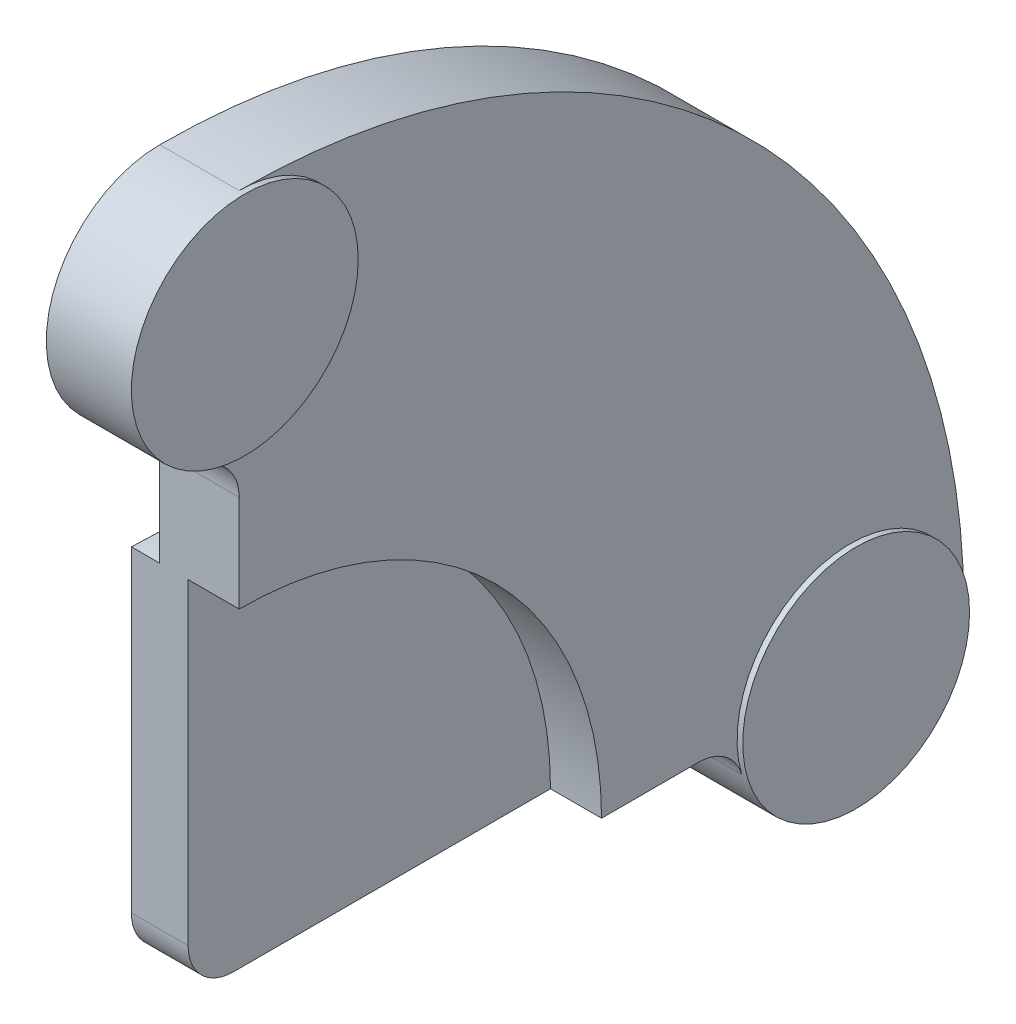
ISO-10303-21;
HEADER;
FILE_DESCRIPTION(('STEP AP214'),'2;1');
FILE_NAME('part.step','',(''),(''),'','','');
FILE_SCHEMA(('AUTOMOTIVE_DESIGN { 1 0 10303 214 1 1 1 1 }'));
ENDSEC;
DATA;
#1=APPLICATION_CONTEXT('core data for automotive mechanical design processes');
#2=APPLICATION_PROTOCOL_DEFINITION('international standard','automotive_design',2000,#1);
#3=PRODUCT_CONTEXT('',#1,'mechanical');
#4=PRODUCT('Part','Part','',(#3));
#5=PRODUCT_RELATED_PRODUCT_CATEGORY('part','',(#4));
#6=PRODUCT_DEFINITION_FORMATION('','',#4);
#7=PRODUCT_DEFINITION_CONTEXT('part definition',#1,'design');
#8=PRODUCT_DEFINITION('design','',#6,#7);
#9=PRODUCT_DEFINITION_SHAPE('','',#8);
#10=(LENGTH_UNIT() NAMED_UNIT(*) SI_UNIT(.MILLI.,.METRE.));
#11=(NAMED_UNIT(*) PLANE_ANGLE_UNIT() SI_UNIT($,.RADIAN.));
#12=(NAMED_UNIT(*) SI_UNIT($,.STERADIAN.) SOLID_ANGLE_UNIT());
#13=UNCERTAINTY_MEASURE_WITH_UNIT(LENGTH_MEASURE(1.E-05),#10,'distance_accuracy_value','');
#14=(GEOMETRIC_REPRESENTATION_CONTEXT(3) GLOBAL_UNCERTAINTY_ASSIGNED_CONTEXT((#13)) GLOBAL_UNIT_ASSIGNED_CONTEXT((#10,
#11,#12)) REPRESENTATION_CONTEXT('',''));
#15=CARTESIAN_POINT('',(0.,0.,0.));
#16=DIRECTION('',(0.,0.,1.));
#17=DIRECTION('',(1.,0.,0.));
#18=AXIS2_PLACEMENT_3D('',#15,#16,#17);
#19=CARTESIAN_POINT('',(2.5,0.,0.));
#20=DIRECTION('',(-1.,0.,0.));
#21=DIRECTION('',(0.,0.,1.));
#22=AXIS2_PLACEMENT_3D('',#19,#20,#21);
#23=CYLINDRICAL_SURFACE('',#22,31.95);
#24=CARTESIAN_POINT('',(0.,0.,0.));
#25=DIRECTION('',(1.,0.,0.));
#26=DIRECTION('',(0.,0.,-1.));
#27=AXIS2_PLACEMENT_3D('',#24,#25,#26);
#28=CIRCLE('',#27,31.95);
#29=CARTESIAN_POINT('',(0.,0.,-31.95));
#30=VERTEX_POINT('',#29);
#31=CARTESIAN_POINT('',(0.,31.95,0.));
#32=VERTEX_POINT('',#31);
#33=EDGE_CURVE('E168',#30,#32,#28,.T.);
#34=ORIENTED_EDGE('',*,*,#33,.F.);
#35=DIRECTION('',(-1.,0.,0.));
#36=VECTOR('',#35,1.);
#37=CARTESIAN_POINT('',(2.5,0.,-31.95));
#38=LINE('',#37,#36);
#39=CARTESIAN_POINT('',(-2.5,0.,-31.95));
#40=VERTEX_POINT('',#39);
#41=EDGE_CURVE('E206',#30,#40,#38,.T.);
#42=ORIENTED_EDGE('',*,*,#41,.T.);
#43=CARTESIAN_POINT('',(-2.5,0.,0.));
#44=DIRECTION('',(1.,0.,0.));
#45=DIRECTION('',(0.,0.,-1.));
#46=AXIS2_PLACEMENT_3D('',#43,#44,#45);
#47=CIRCLE('',#46,31.95);
#48=CARTESIAN_POINT('',(-2.5,31.95,0.));
#49=VERTEX_POINT('',#48);
#50=EDGE_CURVE('E197',#40,#49,#47,.T.);
#51=ORIENTED_EDGE('',*,*,#50,.T.);
#52=DIRECTION('',(-1.,0.,0.));
#53=VECTOR('',#52,1.);
#54=CARTESIAN_POINT('',(2.5,31.95,0.));
#55=LINE('',#54,#53);
#56=EDGE_CURVE('E194',#32,#49,#55,.T.);
#57=ORIENTED_EDGE('',*,*,#56,.F.);
#58=EDGE_LOOP('',(#34,#42,#51,#57));
#59=FACE_BOUND('',#58,.T.);
#60=ADVANCED_FACE('F45',(#59),#23,.T.);
#61=CARTESIAN_POINT('',(2.5,0.,0.));
#62=DIRECTION('',(0.,1.,0.));
#63=DIRECTION('',(0.,0.,1.));
#64=AXIS2_PLACEMENT_3D('',#61,#62,#63);
#65=PLANE('',#64);
#66=DIRECTION('',(0.,0.,-1.));
#67=VECTOR('',#66,1.);
#68=CARTESIAN_POINT('',(0.,0.,0.));
#69=LINE('',#68,#67);
#70=CARTESIAN_POINT('',(0.,0.,-40.4835921350013));
#71=VERTEX_POINT('',#70);
#72=EDGE_CURVE('E161',#30,#71,#69,.T.);
#73=ORIENTED_EDGE('',*,*,#72,.T.);
#74=DIRECTION('',(1.,0.,0.));
#75=VECTOR('',#74,1.);
#76=CARTESIAN_POINT('',(7.,0.,-40.4835921350013));
#77=LINE('',#76,#75);
#78=CARTESIAN_POINT('',(7.,0.,-40.4835921350013));
#79=VERTEX_POINT('',#78);
#80=EDGE_CURVE('E225',#71,#79,#77,.T.);
#81=ORIENTED_EDGE('',*,*,#80,.T.);
#82=DIRECTION('',(0.,0.,-1.));
#83=VECTOR('',#82,1.);
#84=CARTESIAN_POINT('',(7.,0.,0.));
#85=LINE('',#84,#83);
#86=CARTESIAN_POINT('',(7.,0.,-31.95));
#87=VERTEX_POINT('',#86);
#88=EDGE_CURVE('E251',#87,#79,#85,.T.);
#89=ORIENTED_EDGE('',*,*,#88,.F.);
#90=DIRECTION('',(-1.,0.,0.));
#91=VECTOR('',#90,1.);
#92=CARTESIAN_POINT('',(7.,0.,-31.95));
#93=LINE('',#92,#91);
#94=CARTESIAN_POINT('',(2.5,0.,-31.95));
#95=VERTEX_POINT('',#94);
#96=EDGE_CURVE('E152',#87,#95,#93,.T.);
#97=ORIENTED_EDGE('',*,*,#96,.T.);
#98=DIRECTION('',(0.,0.,-1.));
#99=VECTOR('',#98,1.);
#100=CARTESIAN_POINT('',(2.5,0.,0.));
#101=LINE('',#100,#99);
#102=CARTESIAN_POINT('',(2.5,0.,-4.));
#103=VERTEX_POINT('',#102);
#104=EDGE_CURVE('E182',#103,#95,#101,.T.);
#105=ORIENTED_EDGE('',*,*,#104,.F.);
#106=DIRECTION('',(-1.,0.,0.));
#107=VECTOR('',#106,1.);
#108=CARTESIAN_POINT('',(2.5,0.,-4.));
#109=LINE('',#108,#107);
#110=CARTESIAN_POINT('',(-2.5,0.,-4.));
#111=VERTEX_POINT('',#110);
#112=EDGE_CURVE('E210',#103,#111,#109,.T.);
#113=ORIENTED_EDGE('',*,*,#112,.T.);
#114=DIRECTION('',(0.,0.,-1.));
#115=VECTOR('',#114,1.);
#116=CARTESIAN_POINT('',(-2.5,0.,0.));
#117=LINE('',#116,#115);
#118=EDGE_CURVE('E181',#111,#40,#117,.T.);
#119=ORIENTED_EDGE('',*,*,#118,.T.);
#120=ORIENTED_EDGE('',*,*,#41,.F.);
#121=EDGE_LOOP('',(#73,#81,#89,#97,#105,#113,#119,#120));
#122=FACE_BOUND('',#121,.T.);
#123=ADVANCED_FACE('F292',(#122),#65,.F.);
#124=CARTESIAN_POINT('',(2.5,0.,0.));
#125=DIRECTION('',(0.,0.,-1.));
#126=DIRECTION('',(-1.,0.,0.));
#127=AXIS2_PLACEMENT_3D('',#124,#125,#126);
#128=PLANE('',#127);
#129=DIRECTION('',(0.,-1.,0.));
#130=VECTOR('',#129,1.);
#131=CARTESIAN_POINT('',(7.,0.,0.));
#132=LINE('',#131,#130);
#133=CARTESIAN_POINT('',(7.,40.4835921350013,0.));
#134=VERTEX_POINT('',#133);
#135=CARTESIAN_POINT('',(7.,31.95,0.));
#136=VERTEX_POINT('',#135);
#137=EDGE_CURVE('E175',#134,#136,#132,.T.);
#138=ORIENTED_EDGE('',*,*,#137,.F.);
#139=DIRECTION('',(1.,0.,0.));
#140=VECTOR('',#139,1.);
#141=CARTESIAN_POINT('',(0.,40.4835921350013,0.));
#142=LINE('',#141,#140);
#143=CARTESIAN_POINT('',(0.,40.4835921350013,0.));
#144=VERTEX_POINT('',#143);
#145=EDGE_CURVE('E228',#134,#144,#142,.F.);
#146=ORIENTED_EDGE('',*,*,#145,.T.);
#147=DIRECTION('',(0.,-1.,0.));
#148=VECTOR('',#147,1.);
#149=CARTESIAN_POINT('',(0.,0.,0.));
#150=LINE('',#149,#148);
#151=EDGE_CURVE('E160',#144,#32,#150,.T.);
#152=ORIENTED_EDGE('',*,*,#151,.T.);
#153=ORIENTED_EDGE('',*,*,#56,.T.);
#154=DIRECTION('',(0.,-1.,0.));
#155=VECTOR('',#154,1.);
#156=CARTESIAN_POINT('',(-2.5,0.,0.));
#157=LINE('',#156,#155);
#158=CARTESIAN_POINT('',(-2.5,4.,0.));
#159=VERTEX_POINT('',#158);
#160=EDGE_CURVE('E186',#49,#159,#157,.T.);
#161=ORIENTED_EDGE('',*,*,#160,.T.);
#162=DIRECTION('',(-1.,0.,0.));
#163=VECTOR('',#162,1.);
#164=CARTESIAN_POINT('',(2.5,4.,0.));
#165=LINE('',#164,#163);
#166=CARTESIAN_POINT('',(2.5,4.,0.));
#167=VERTEX_POINT('',#166);
#168=EDGE_CURVE('E217',#159,#167,#165,.F.);
#169=ORIENTED_EDGE('',*,*,#168,.T.);
#170=DIRECTION('',(0.,-1.,0.));
#171=VECTOR('',#170,1.);
#172=CARTESIAN_POINT('',(2.5,0.,0.));
#173=LINE('',#172,#171);
#174=CARTESIAN_POINT('',(2.5,31.95,0.));
#175=VERTEX_POINT('',#174);
#176=EDGE_CURVE('E190',#175,#167,#173,.T.);
#177=ORIENTED_EDGE('',*,*,#176,.F.);
#178=DIRECTION('',(-1.,0.,0.));
#179=VECTOR('',#178,1.);
#180=CARTESIAN_POINT('',(7.,31.95,0.));
#181=LINE('',#180,#179);
#182=EDGE_CURVE('E172',#136,#175,#181,.T.);
#183=ORIENTED_EDGE('',*,*,#182,.F.);
#184=EDGE_LOOP('',(#138,#146,#152,#153,#161,#169,#177,#183));
#185=FACE_BOUND('',#184,.T.);
#186=ADVANCED_FACE('F299',(#185),#128,.F.);
#187=CARTESIAN_POINT('',(2.5,0.,0.));
#188=DIRECTION('',(1.,0.,0.));
#189=DIRECTION('',(0.,0.,-1.));
#190=AXIS2_PLACEMENT_3D('',#187,#188,#189);
#191=PLANE('',#190);
#192=ORIENTED_EDGE('',*,*,#176,.T.);
#193=CARTESIAN_POINT('',(2.5,4.,-4.));
#194=DIRECTION('',(1.,0.,0.));
#195=DIRECTION('',(0.,0.,-1.));
#196=AXIS2_PLACEMENT_3D('',#193,#194,#195);
#197=CIRCLE('',#196,4.);
#198=EDGE_CURVE('E220',#167,#103,#197,.T.);
#199=ORIENTED_EDGE('',*,*,#198,.T.);
#200=ORIENTED_EDGE('',*,*,#104,.T.);
#201=CARTESIAN_POINT('',(2.5,0.,0.));
#202=DIRECTION('',(1.,0.,0.));
#203=DIRECTION('',(0.,0.,-1.));
#204=AXIS2_PLACEMENT_3D('',#201,#202,#203);
#205=CIRCLE('',#204,31.95);
#206=EDGE_CURVE('E185',#95,#175,#205,.T.);
#207=ORIENTED_EDGE('',*,*,#206,.T.);
#208=EDGE_LOOP('',(#192,#199,#200,#207));
#209=FACE_BOUND('',#208,.T.);
#210=ADVANCED_FACE('F343',(#209),#191,.T.);
#211=CARTESIAN_POINT('',(-2.5,0.,0.));
#212=DIRECTION('',(1.,0.,0.));
#213=DIRECTION('',(0.,0.,-1.));
#214=AXIS2_PLACEMENT_3D('',#211,#212,#213);
#215=PLANE('',#214);
#216=ORIENTED_EDGE('',*,*,#118,.F.);
#217=CARTESIAN_POINT('',(-2.5,4.,-4.));
#218=DIRECTION('',(1.,0.,0.));
#219=DIRECTION('',(0.,0.,-1.));
#220=AXIS2_PLACEMENT_3D('',#217,#218,#219);
#221=CIRCLE('',#220,4.);
#222=EDGE_CURVE('E214',#111,#159,#221,.F.);
#223=ORIENTED_EDGE('',*,*,#222,.T.);
#224=ORIENTED_EDGE('',*,*,#160,.F.);
#225=ORIENTED_EDGE('',*,*,#50,.F.);
#226=EDGE_LOOP('',(#216,#223,#224,#225));
#227=FACE_BOUND('',#226,.T.);
#228=ADVANCED_FACE('F342',(#227),#215,.F.);
#229=CARTESIAN_POINT('',(7.,0.,0.));
#230=DIRECTION('',(-1.,0.,0.));
#231=DIRECTION('',(0.,0.,1.));
#232=AXIS2_PLACEMENT_3D('',#229,#230,#231);
#233=CYLINDRICAL_SURFACE('',#232,31.95);
#234=ORIENTED_EDGE('',*,*,#182,.T.);
#235=ORIENTED_EDGE('',*,*,#206,.F.);
#236=ORIENTED_EDGE('',*,*,#96,.F.);
#237=CARTESIAN_POINT('',(7.,0.,0.));
#238=DIRECTION('',(1.,0.,0.));
#239=DIRECTION('',(0.,0.,-1.));
#240=AXIS2_PLACEMENT_3D('',#237,#238,#239);
#241=CIRCLE('',#240,31.95);
#242=EDGE_CURVE('E165',#87,#136,#241,.T.);
#243=ORIENTED_EDGE('',*,*,#242,.T.);
#244=EDGE_LOOP('',(#234,#235,#236,#243));
#245=FACE_BOUND('',#244,.T.);
#246=ADVANCED_FACE('F340',(#245),#233,.F.);
#247=CARTESIAN_POINT('',(7.,0.,0.));
#248=DIRECTION('',(-1.,0.,0.));
#249=DIRECTION('',(0.,0.,1.));
#250=AXIS2_PLACEMENT_3D('',#247,#248,#249);
#251=CYLINDRICAL_SURFACE('',#250,63.9);
#252=CARTESIAN_POINT('',(0.,0.,0.));
#253=DIRECTION('',(1.,0.,0.));
#254=DIRECTION('',(0.,0.,-1.));
#255=AXIS2_PLACEMENT_3D('',#252,#253,#254);
#256=CIRCLE('',#255,63.9);
#257=CARTESIAN_POINT('',(0.,0.,-63.9));
#258=VERTEX_POINT('',#257);
#259=CARTESIAN_POINT('',(0.,63.9,0.));
#260=VERTEX_POINT('',#259);
#261=EDGE_CURVE('E148',#258,#260,#256,.T.);
#262=ORIENTED_EDGE('',*,*,#261,.T.);
#263=DIRECTION('',(-1.,0.,0.));
#264=VECTOR('',#263,1.);
#265=CARTESIAN_POINT('',(7.,63.9,0.));
#266=LINE('',#265,#264);
#267=CARTESIAN_POINT('',(7.,63.9,0.));
#268=VERTEX_POINT('',#267);
#269=EDGE_CURVE('E153',#268,#260,#266,.T.);
#270=ORIENTED_EDGE('',*,*,#269,.F.);
#271=CARTESIAN_POINT('',(7.,0.,0.));
#272=DIRECTION('',(1.,0.,0.));
#273=DIRECTION('',(0.,0.,-1.));
#274=AXIS2_PLACEMENT_3D('',#271,#272,#273);
#275=CIRCLE('',#274,63.9);
#276=CARTESIAN_POINT('',(7.,0.,-63.9));
#277=VERTEX_POINT('',#276);
#278=EDGE_CURVE('E149',#277,#268,#275,.T.);
#279=ORIENTED_EDGE('',*,*,#278,.F.);
#280=DIRECTION('',(-1.,0.,0.));
#281=VECTOR('',#280,1.);
#282=CARTESIAN_POINT('',(7.,0.,-63.9));
#283=LINE('',#282,#281);
#284=EDGE_CURVE('E136',#277,#258,#283,.T.);
#285=ORIENTED_EDGE('',*,*,#284,.T.);
#286=EDGE_LOOP('',(#262,#270,#279,#285));
#287=FACE_BOUND('',#286,.T.);
#288=ADVANCED_FACE('F146',(#287),#251,.T.);
#289=CARTESIAN_POINT('',(7.,0.,0.));
#290=DIRECTION('',(1.,0.,0.));
#291=DIRECTION('',(0.,0.,-1.));
#292=AXIS2_PLACEMENT_3D('',#289,#290,#291);
#293=PLANE('',#292);
#294=ORIENTED_EDGE('',*,*,#242,.F.);
#295=ORIENTED_EDGE('',*,*,#88,.T.);
#296=CARTESIAN_POINT('',(7.,-4.,-40.4835921350013));
#297=DIRECTION('',(1.,0.,0.));
#298=DIRECTION('',(0.,0.,-1.));
#299=AXIS2_PLACEMENT_3D('',#296,#297,#298);
#300=CIRCLE('',#299,4.);
#301=CARTESIAN_POINT('',(7.,-2.85714285714286,-44.3168515250009));
#302=VERTEX_POINT('',#301);
#303=EDGE_CURVE('E238',#79,#302,#300,.F.);
#304=ORIENTED_EDGE('',*,*,#303,.T.);
#305=CARTESIAN_POINT('',(7.,0.,-53.9));
#306=DIRECTION('',(1.,0.,0.));
#307=DIRECTION('',(0.,0.,-1.));
#308=AXIS2_PLACEMENT_3D('',#305,#306,#307);
#309=CIRCLE('',#308,10.);
#310=EDGE_CURVE('E248',#277,#302,#309,.T.);
#311=ORIENTED_EDGE('',*,*,#310,.F.);
#312=ORIENTED_EDGE('',*,*,#278,.T.);
#313=CARTESIAN_POINT('',(7.,53.9,0.));
#314=DIRECTION('',(1.,0.,0.));
#315=DIRECTION('',(0.,0.,-1.));
#316=AXIS2_PLACEMENT_3D('',#313,#314,#315);
#317=CIRCLE('',#316,10.);
#318=CARTESIAN_POINT('',(7.,44.3168515250009,2.85714285714286));
#319=VERTEX_POINT('',#318);
#320=EDGE_CURVE('E60',#319,#268,#317,.T.);
#321=ORIENTED_EDGE('',*,*,#320,.F.);
#322=CARTESIAN_POINT('',(7.,40.4835921350013,4.));
#323=DIRECTION('',(1.,0.,0.));
#324=DIRECTION('',(0.,0.,-1.));
#325=AXIS2_PLACEMENT_3D('',#322,#323,#324);
#326=CIRCLE('',#325,4.);
#327=EDGE_CURVE('E11',#319,#134,#326,.F.);
#328=ORIENTED_EDGE('',*,*,#327,.T.);
#329=ORIENTED_EDGE('',*,*,#137,.T.);
#330=EDGE_LOOP('',(#294,#295,#304,#311,#312,#321,#328,#329));
#331=FACE_BOUND('',#330,.T.);
#332=ADVANCED_FACE('F315',(#331),#293,.T.);
#333=CARTESIAN_POINT('',(0.,0.,0.));
#334=DIRECTION('',(1.,0.,0.));
#335=DIRECTION('',(0.,0.,-1.));
#336=AXIS2_PLACEMENT_3D('',#333,#334,#335);
#337=PLANE('',#336);
#338=ORIENTED_EDGE('',*,*,#33,.T.);
#339=ORIENTED_EDGE('',*,*,#151,.F.);
#340=CARTESIAN_POINT('',(0.,40.4835921350013,4.));
#341=DIRECTION('',(1.,0.,0.));
#342=DIRECTION('',(0.,0.,-1.));
#343=AXIS2_PLACEMENT_3D('',#340,#341,#342);
#344=CIRCLE('',#343,4.);
#345=CARTESIAN_POINT('',(0.,44.3168515250009,2.85714285714286));
#346=VERTEX_POINT('',#345);
#347=EDGE_CURVE('E54',#144,#346,#344,.T.);
#348=ORIENTED_EDGE('',*,*,#347,.T.);
#349=CARTESIAN_POINT('',(0.,53.9,0.));
#350=DIRECTION('',(1.,0.,0.));
#351=DIRECTION('',(0.,0.,-1.));
#352=AXIS2_PLACEMENT_3D('',#349,#350,#351);
#353=CIRCLE('',#352,10.);
#354=EDGE_CURVE('E157',#260,#346,#353,.T.);
#355=ORIENTED_EDGE('',*,*,#354,.F.);
#356=ORIENTED_EDGE('',*,*,#261,.F.);
#357=CARTESIAN_POINT('',(0.,0.,-53.9));
#358=DIRECTION('',(1.,0.,0.));
#359=DIRECTION('',(0.,0.,-1.));
#360=AXIS2_PLACEMENT_3D('',#357,#358,#359);
#361=CIRCLE('',#360,10.);
#362=CARTESIAN_POINT('',(0.,-2.85714285714286,-44.3168515250009));
#363=VERTEX_POINT('',#362);
#364=EDGE_CURVE('E133',#363,#258,#361,.T.);
#365=ORIENTED_EDGE('',*,*,#364,.F.);
#366=CARTESIAN_POINT('',(0.,-4.,-40.4835921350013));
#367=DIRECTION('',(1.,0.,0.));
#368=DIRECTION('',(0.,0.,-1.));
#369=AXIS2_PLACEMENT_3D('',#366,#367,#368);
#370=CIRCLE('',#369,4.);
#371=EDGE_CURVE('E235',#363,#71,#370,.T.);
#372=ORIENTED_EDGE('',*,*,#371,.T.);
#373=ORIENTED_EDGE('',*,*,#72,.F.);
#374=EDGE_LOOP('',(#338,#339,#348,#355,#356,#365,#372,#373));
#375=FACE_BOUND('',#374,.T.);
#376=ADVANCED_FACE('F156',(#375),#337,.F.);
#377=CARTESIAN_POINT('',(7.5,53.9,0.));
#378=DIRECTION('',(-1.,0.,0.));
#379=DIRECTION('',(0.,0.,1.));
#380=AXIS2_PLACEMENT_3D('',#377,#378,#379);
#381=CYLINDRICAL_SURFACE('',#380,10.);
#382=CARTESIAN_POINT('',(7.5,53.9,0.));
#383=DIRECTION('',(1.,0.,0.));
#384=DIRECTION('',(0.,0.,-1.));
#385=AXIS2_PLACEMENT_3D('',#382,#383,#384);
#386=CIRCLE('',#385,10.);
#387=CARTESIAN_POINT('',(7.5,53.9,-10.));
#388=VERTEX_POINT('',#387);
#389=EDGE_CURVE('E263',#388,#388,#386,.T.);
#390=ORIENTED_EDGE('',*,*,#389,.F.);
#391=EDGE_LOOP('',(#390));
#392=FACE_BOUND('',#391,.T.);
#393=ORIENTED_EDGE('',*,*,#354,.T.);
#394=DIRECTION('',(-1.,0.,0.));
#395=VECTOR('',#394,1.);
#396=CARTESIAN_POINT('',(7.5,44.3168515250009,2.85714285714286));
#397=LINE('',#396,#395);
#398=EDGE_CURVE('E232',#346,#319,#397,.F.);
#399=ORIENTED_EDGE('',*,*,#398,.T.);
#400=ORIENTED_EDGE('',*,*,#320,.T.);
#401=ORIENTED_EDGE('',*,*,#269,.T.);
#402=EDGE_LOOP('',(#393,#399,#400,#401));
#403=FACE_BOUND('',#402,.T.);
#404=ADVANCED_FACE('F289',(#392,#403),#381,.T.);
#405=CARTESIAN_POINT('',(7.5,0.,0.));
#406=DIRECTION('',(1.,0.,0.));
#407=DIRECTION('',(0.,0.,-1.));
#408=AXIS2_PLACEMENT_3D('',#405,#406,#407);
#409=PLANE('',#408);
#410=ORIENTED_EDGE('',*,*,#389,.T.);
#411=EDGE_LOOP('',(#410));
#412=FACE_BOUND('',#411,.T.);
#413=ADVANCED_FACE('F279',(#412),#409,.T.);
#414=CARTESIAN_POINT('',(7.5,0.,-53.9));
#415=DIRECTION('',(-1.,0.,0.));
#416=DIRECTION('',(0.,0.,1.));
#417=AXIS2_PLACEMENT_3D('',#414,#415,#416);
#418=CYLINDRICAL_SURFACE('',#417,10.);
#419=CARTESIAN_POINT('',(7.5,0.,-53.9));
#420=DIRECTION('',(1.,0.,0.));
#421=DIRECTION('',(0.,0.,-1.));
#422=AXIS2_PLACEMENT_3D('',#419,#420,#421);
#423=CIRCLE('',#422,10.);
#424=CARTESIAN_POINT('',(7.5,0.,-63.9));
#425=VERTEX_POINT('',#424);
#426=EDGE_CURVE('E142',#425,#425,#423,.T.);
#427=ORIENTED_EDGE('',*,*,#426,.F.);
#428=EDGE_LOOP('',(#427));
#429=FACE_BOUND('',#428,.T.);
#430=ORIENTED_EDGE('',*,*,#310,.T.);
#431=DIRECTION('',(-1.,0.,0.));
#432=VECTOR('',#431,1.);
#433=CARTESIAN_POINT('',(7.5,-2.85714285714286,-44.3168515250009));
#434=LINE('',#433,#432);
#435=EDGE_CURVE('E139',#302,#363,#434,.T.);
#436=ORIENTED_EDGE('',*,*,#435,.T.);
#437=ORIENTED_EDGE('',*,*,#364,.T.);
#438=ORIENTED_EDGE('',*,*,#284,.F.);
#439=EDGE_LOOP('',(#430,#436,#437,#438));
#440=FACE_BOUND('',#439,.T.);
#441=ADVANCED_FACE('F135',(#429,#440),#418,.T.);
#442=CARTESIAN_POINT('',(7.5,0.,0.));
#443=DIRECTION('',(1.,0.,0.));
#444=DIRECTION('',(0.,0.,-1.));
#445=AXIS2_PLACEMENT_3D('',#442,#443,#444);
#446=PLANE('',#445);
#447=ORIENTED_EDGE('',*,*,#426,.T.);
#448=EDGE_LOOP('',(#447));
#449=FACE_BOUND('',#448,.T.);
#450=ADVANCED_FACE('F276',(#449),#446,.T.);
#451=CARTESIAN_POINT('',(2.5,4.,-4.));
#452=DIRECTION('',(-1.,0.,0.));
#453=DIRECTION('',(0.,0.,1.));
#454=AXIS2_PLACEMENT_3D('',#451,#452,#453);
#455=CYLINDRICAL_SURFACE('',#454,4.);
#456=ORIENTED_EDGE('',*,*,#198,.F.);
#457=ORIENTED_EDGE('',*,*,#168,.F.);
#458=ORIENTED_EDGE('',*,*,#222,.F.);
#459=ORIENTED_EDGE('',*,*,#112,.F.);
#460=EDGE_LOOP('',(#456,#457,#458,#459));
#461=FACE_BOUND('',#460,.T.);
#462=ADVANCED_FACE('F286',(#461),#455,.T.);
#463=CARTESIAN_POINT('',(7.5,-4.,-40.4835921350013));
#464=DIRECTION('',(-1.,0.,0.));
#465=DIRECTION('',(0.,0.,1.));
#466=AXIS2_PLACEMENT_3D('',#463,#464,#465);
#467=CYLINDRICAL_SURFACE('',#466,4.);
#468=ORIENTED_EDGE('',*,*,#303,.F.);
#469=ORIENTED_EDGE('',*,*,#80,.F.);
#470=ORIENTED_EDGE('',*,*,#371,.F.);
#471=ORIENTED_EDGE('',*,*,#435,.F.);
#472=EDGE_LOOP('',(#468,#469,#470,#471));
#473=FACE_BOUND('',#472,.T.);
#474=ADVANCED_FACE('F306',(#473),#467,.F.);
#475=CARTESIAN_POINT('',(7.5,40.4835921350013,4.));
#476=DIRECTION('',(-1.,0.,0.));
#477=DIRECTION('',(0.,0.,1.));
#478=AXIS2_PLACEMENT_3D('',#475,#476,#477);
#479=CYLINDRICAL_SURFACE('',#478,4.);
#480=ORIENTED_EDGE('',*,*,#327,.F.);
#481=ORIENTED_EDGE('',*,*,#398,.F.);
#482=ORIENTED_EDGE('',*,*,#347,.F.);
#483=ORIENTED_EDGE('',*,*,#145,.F.);
#484=EDGE_LOOP('',(#480,#481,#482,#483));
#485=FACE_BOUND('',#484,.T.);
#486=ADVANCED_FACE('F47',(#485),#479,.F.);
#487=CLOSED_SHELL('',(#60,#123,#186,#210,#228,#246,#288,#332,#376,#404,#413,#441,#450,#462,#474,#486));
#488=MANIFOLD_SOLID_BREP('B2',#487);
#489=ADVANCED_BREP_SHAPE_REPRESENTATION('',(#18,#488),#14);
#490=SHAPE_DEFINITION_REPRESENTATION(#9,#489);
ENDSEC;
END-ISO-10303-21;
